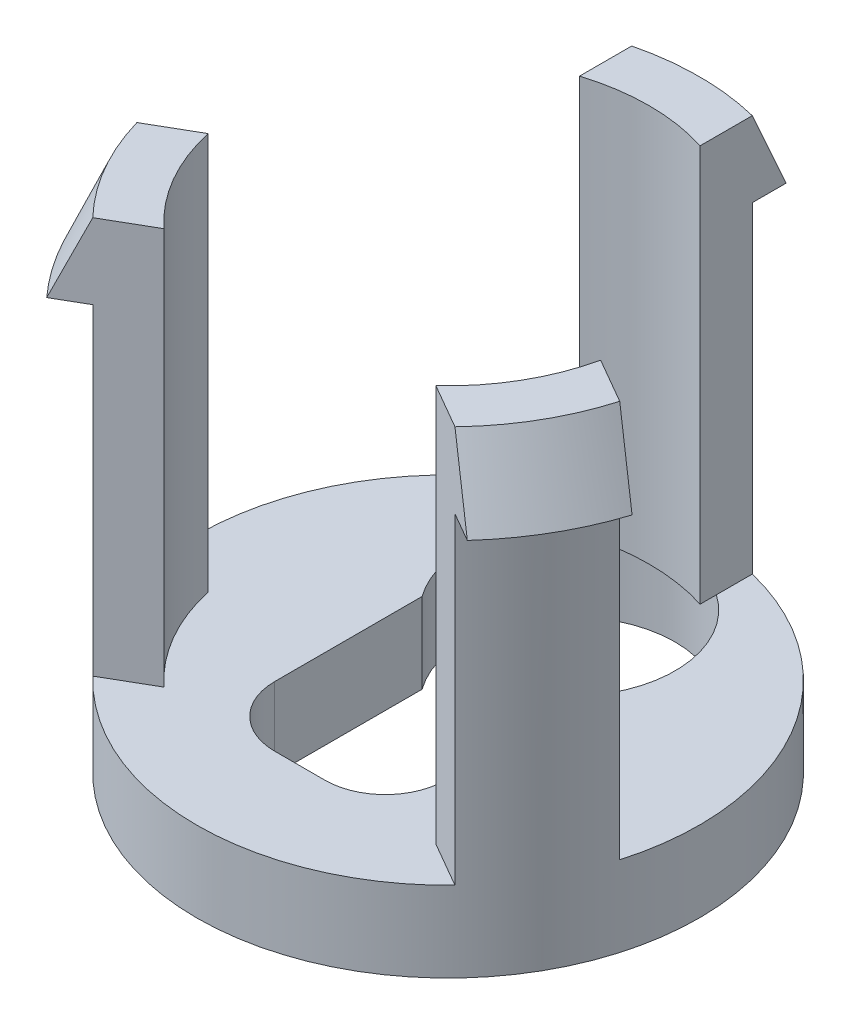
ISO-10303-21;
HEADER;
FILE_DESCRIPTION(('STEP AP214'),'2;1');
FILE_NAME('part.step','',(''),(''),'','','');
FILE_SCHEMA(('AUTOMOTIVE_DESIGN { 1 0 10303 214 1 1 1 1 }'));
ENDSEC;
DATA;
#1=APPLICATION_CONTEXT('core data for automotive mechanical design processes');
#2=APPLICATION_PROTOCOL_DEFINITION('international standard','automotive_design',2000,#1);
#3=PRODUCT_CONTEXT('',#1,'mechanical');
#4=PRODUCT('Part','Part','',(#3));
#5=PRODUCT_RELATED_PRODUCT_CATEGORY('part','',(#4));
#6=PRODUCT_DEFINITION_FORMATION('','',#4);
#7=PRODUCT_DEFINITION_CONTEXT('part definition',#1,'design');
#8=PRODUCT_DEFINITION('design','',#6,#7);
#9=PRODUCT_DEFINITION_SHAPE('','',#8);
#10=(LENGTH_UNIT() NAMED_UNIT(*) SI_UNIT(.MILLI.,.METRE.));
#11=(NAMED_UNIT(*) PLANE_ANGLE_UNIT() SI_UNIT($,.RADIAN.));
#12=(NAMED_UNIT(*) SI_UNIT($,.STERADIAN.) SOLID_ANGLE_UNIT());
#13=UNCERTAINTY_MEASURE_WITH_UNIT(LENGTH_MEASURE(1.E-05),#10,'distance_accuracy_value','');
#14=(GEOMETRIC_REPRESENTATION_CONTEXT(3) GLOBAL_UNCERTAINTY_ASSIGNED_CONTEXT((#13)) GLOBAL_UNIT_ASSIGNED_CONTEXT((#10,
#11,#12)) REPRESENTATION_CONTEXT('',''));
#15=CARTESIAN_POINT('',(0.,0.,0.));
#16=DIRECTION('',(0.,0.,1.));
#17=DIRECTION('',(1.,0.,0.));
#18=AXIS2_PLACEMENT_3D('',#15,#16,#17);
#19=CARTESIAN_POINT('',(0.,8.,-5.65386443980464));
#20=DIRECTION('',(0.,-1.,0.));
#21=DIRECTION('',(0.,0.,-1.));
#22=AXIS2_PLACEMENT_3D('',#19,#20,#21);
#23=PLANE('',#22);
#24=DIRECTION('',(0.,0.,-1.));
#25=VECTOR('',#24,1.);
#26=CARTESIAN_POINT('',(1.2,8.,-5.52505050689018));
#27=LINE('',#26,#25);
#28=CARTESIAN_POINT('',(1.2,8.,-4.85386443980464));
#29=VERTEX_POINT('',#28);
#30=CARTESIAN_POINT('',(1.2,8.,-5.52505050689018));
#31=VERTEX_POINT('',#30);
#32=EDGE_CURVE('E265',#29,#31,#27,.T.);
#33=ORIENTED_EDGE('',*,*,#32,.F.);
#34=CARTESIAN_POINT('',(0.,8.,0.));
#35=DIRECTION('',(0.,-1.,0.));
#36=DIRECTION('',(0.,0.,-1.));
#37=AXIS2_PLACEMENT_3D('',#34,#35,#36);
#38=CIRCLE('',#37,5.);
#39=CARTESIAN_POINT('',(-1.2,8.,-4.85386443980464));
#40=VERTEX_POINT('',#39);
#41=EDGE_CURVE('E365',#40,#29,#38,.T.);
#42=ORIENTED_EDGE('',*,*,#41,.F.);
#43=DIRECTION('',(0.,0.,1.));
#44=VECTOR('',#43,1.);
#45=CARTESIAN_POINT('',(-1.2,8.,-4.85386443980464));
#46=LINE('',#45,#44);
#47=CARTESIAN_POINT('',(-1.2,8.,-5.52505050689018));
#48=VERTEX_POINT('',#47);
#49=EDGE_CURVE('E496',#48,#40,#46,.T.);
#50=ORIENTED_EDGE('',*,*,#49,.F.);
#51=CARTESIAN_POINT('',(0.,8.00000000000001,0.));
#52=DIRECTION('',(0.,-1.,0.));
#53=DIRECTION('',(0.,0.,-1.));
#54=AXIS2_PLACEMENT_3D('',#51,#52,#53);
#55=CIRCLE('',#54,5.65386443980464);
#56=EDGE_CURVE('E357',#48,#31,#55,.T.);
#57=ORIENTED_EDGE('',*,*,#56,.T.);
#58=EDGE_LOOP('',(#33,#42,#50,#57));
#59=FACE_BOUND('',#58,.T.);
#60=ADVANCED_FACE('F33',(#59),#23,.T.);
#61=CARTESIAN_POINT('',(0.,8.00000000000001,0.));
#62=DIRECTION('',(0.,-1.,0.));
#63=DIRECTION('',(0.,0.,-1.));
#64=AXIS2_PLACEMENT_3D('',#61,#62,#63);
#65=CONICAL_SURFACE('',#64,5.65386443980464,0.411074791521968);
#66=CARTESIAN_POINT('',(1.2,5.21684046626345,-6.76140938545169));
#67=CARTESIAN_POINT('',(1.2,5.71747251316698,-6.53974644398967));
#68=CARTESIAN_POINT('',(1.2,6.21799738542379,-6.31784047831135));
#69=CARTESIAN_POINT('',(1.2,7.21870370792567,-5.87326281222212));
#70=CARTESIAN_POINT('',(1.2,7.7188851599612,-5.65059111584039));
#71=CARTESIAN_POINT('',(1.2,8.71878257367702,-5.20419920142983));
#72=CARTESIAN_POINT('',(1.2,9.21849853373002,-4.98047897975189));
#73=CARTESIAN_POINT('',(1.2,9.9675476490754,-4.64372744977575));
#74=CARTESIAN_POINT('',(1.2,10.2171438691791,-4.53128144443169));
#75=CARTESIAN_POINT('',(1.2,10.7161131188899,-4.30589453839525));
#76=CARTESIAN_POINT('',(1.2,10.9654861482009,-4.19295363704744));
#77=CARTESIAN_POINT('',(1.2,11.2147233456066,-4.07971309248931));
#78=B_SPLINE_CURVE_WITH_KNOTS('',3,(#66,#67,#68,#69,#70,#71,#72,#73,#74,#75,#76,#77),
.UNSPECIFIED.,.F.,.F.,(4,2,2,2,2,4),(0.,1.64252968817511,3.28505074673803,4.92757752588393,
5.74884521357266,6.57011398925771),.UNSPECIFIED.);
#79=CARTESIAN_POINT('',(1.2,9.5,-4.85386443980464));
#80=VERTEX_POINT('',#79);
#81=EDGE_CURVE('E274',#31,#80,#78,.T.);
#82=ORIENTED_EDGE('',*,*,#81,.F.);
#83=ORIENTED_EDGE('',*,*,#56,.F.);
#84=CARTESIAN_POINT('',(-1.2,11.2147233456066,-4.07971309248931));
#85=CARTESIAN_POINT('',(-1.2,10.9654861482009,-4.19295363704744));
#86=CARTESIAN_POINT('',(-1.2,10.7161131188899,-4.30589453839525));
#87=CARTESIAN_POINT('',(-1.2,10.2171438691791,-4.53128144443169));
#88=CARTESIAN_POINT('',(-1.2,9.96754764907539,-4.64372744977575));
#89=CARTESIAN_POINT('',(-1.2,9.21849853373002,-4.9804789797519));
#90=CARTESIAN_POINT('',(-1.2,8.71878257367702,-5.20419920142983));
#91=CARTESIAN_POINT('',(-1.2,7.7188851599612,-5.65059111584039));
#92=CARTESIAN_POINT('',(-1.2,7.21870370792567,-5.87326281222212));
#93=CARTESIAN_POINT('',(-1.2,6.21799738542379,-6.31784047831135));
#94=CARTESIAN_POINT('',(-1.2,5.71747251316698,-6.53974644398967));
#95=CARTESIAN_POINT('',(-1.2,5.21684046626345,-6.76140938545169));
#96=B_SPLINE_CURVE_WITH_KNOTS('',3,(#84,#85,#86,#87,#88,#89,#90,#91,#92,#93,#94,#95),
.UNSPECIFIED.,.F.,.F.,(4,2,2,2,2,4),(0.,0.82126877568505,1.64253646337379,3.28506324251968,
4.9275843010826,6.57011398925771),.UNSPECIFIED.);
#97=CARTESIAN_POINT('',(-1.2,9.5,-4.85386443980464));
#98=VERTEX_POINT('',#97);
#99=EDGE_CURVE('E358',#98,#48,#96,.T.);
#100=ORIENTED_EDGE('',*,*,#99,.F.);
#101=CARTESIAN_POINT('',(0.,9.5,0.));
#102=DIRECTION('',(0.,1.,0.));
#103=DIRECTION('',(0.,0.,1.));
#104=AXIS2_PLACEMENT_3D('',#101,#102,#103);
#105=CIRCLE('',#104,5.);
#106=EDGE_CURVE('E429',#80,#98,#105,.T.);
#107=ORIENTED_EDGE('',*,*,#106,.F.);
#108=EDGE_LOOP('',(#82,#83,#100,#107));
#109=FACE_BOUND('',#108,.T.);
#110=ADVANCED_FACE('F321',(#109),#65,.T.);
#111=DIRECTION('',(-0.866025403784437,0.,-0.500000000000002));
#112=VECTOR('',#111,1.);
#113=CARTESIAN_POINT('',(4.80356991139674,8.,1.38770173536102));
#114=LINE('',#113,#112);
#115=CARTESIAN_POINT('',(5.38483409615898,8.,1.72329476890379));
#116=VERTEX_POINT('',#115);
#117=CARTESIAN_POINT('',(4.80356991139674,8.,1.38770173536102));
#118=VERTEX_POINT('',#117);
#119=EDGE_CURVE('E263',#116,#118,#114,.T.);
#120=ORIENTED_EDGE('',*,*,#119,.F.);
#121=CARTESIAN_POINT('',(4.18483409615897,8.,3.80175573798644));
#122=VERTEX_POINT('',#121);
#123=EDGE_CURVE('E355',#116,#122,#55,.T.);
#124=ORIENTED_EDGE('',*,*,#123,.T.);
#125=DIRECTION('',(0.866025403784436,0.,0.500000000000004));
#126=VECTOR('',#125,1.);
#127=CARTESIAN_POINT('',(4.18483409615897,8.,3.80175573798644));
#128=LINE('',#127,#126);
#129=CARTESIAN_POINT('',(3.60356991139673,8.,3.46616270444366));
#130=VERTEX_POINT('',#129);
#131=EDGE_CURVE('E348',#130,#122,#128,.T.);
#132=ORIENTED_EDGE('',*,*,#131,.F.);
#133=EDGE_CURVE('E364',#118,#130,#38,.T.);
#134=ORIENTED_EDGE('',*,*,#133,.F.);
#135=EDGE_LOOP('',(#120,#124,#132,#134));
#136=FACE_BOUND('',#135,.T.);
#137=ADVANCED_FACE('F323',(#136),#23,.T.);
#138=CARTESIAN_POINT('',(4.80349213645757,9.5002,1.38765683197895));
#139=CARTESIAN_POINT('',(4.90066141870623,9.25027080369993,1.44375754324218));
#140=CARTESIAN_POINT('',(4.99769766276035,9.00027286931798,1.49978144486798));
#141=CARTESIAN_POINT('',(5.19150406998907,8.50013953597828,1.61167562625215));
#142=CARTESIAN_POINT('',(5.28827423317601,8.25000413702689,1.66754590601766));
#143=CARTESIAN_POINT('',(5.38491135818073,7.9998,1.72333937615284));
#144=B_SPLINE_CURVE_WITH_KNOTS('',3,(#138,#139,#140,#141,#142,#143),.UNSPECIFIED.,.F.,.F.,(4,2,
4),(0.,0.821877786948107,1.64375553581094),.UNSPECIFIED.);
#145=CARTESIAN_POINT('',(4.80356991139674,9.5,1.38770173536102));
#146=VERTEX_POINT('',#145);
#147=EDGE_CURVE('E267',#146,#116,#144,.T.);
#148=ORIENTED_EDGE('',*,*,#147,.F.);
#149=CARTESIAN_POINT('',(3.60356991139673,9.5,3.46616270444366));
#150=VERTEX_POINT('',#149);
#151=EDGE_CURVE('E425',#150,#146,#105,.T.);
#152=ORIENTED_EDGE('',*,*,#151,.F.);
#153=CARTESIAN_POINT('',(4.18491135818072,7.9998,3.80180034523549));
#154=CARTESIAN_POINT('',(4.088274233176,8.25000413702689,3.7460068751003));
#155=CARTESIAN_POINT('',(3.99150406998906,8.50013953597828,3.6901365953348));
#156=CARTESIAN_POINT('',(3.79769766276034,9.00027286931798,3.57824241395062));
#157=CARTESIAN_POINT('',(3.70066141870622,9.25027080369992,3.52221851232483));
#158=CARTESIAN_POINT('',(3.60349213645756,9.5002,3.4661178010616));
#159=B_SPLINE_CURVE_WITH_KNOTS('',3,(#153,#154,#155,#156,#157,#158),.UNSPECIFIED.,.F.,.F.,(4,2,
4),(0.,0.821877748862831,1.64375553581094),.UNSPECIFIED.);
#160=EDGE_CURVE('E497',#122,#150,#159,.T.);
#161=ORIENTED_EDGE('',*,*,#160,.F.);
#162=ORIENTED_EDGE('',*,*,#123,.F.);
#163=EDGE_LOOP('',(#148,#152,#161,#162));
#164=FACE_BOUND('',#163,.T.);
#165=ADVANCED_FACE('F297',(#164),#65,.T.);
#166=CARTESIAN_POINT('',(0.,9.5,0.));
#167=DIRECTION('',(0.,1.,0.));
#168=DIRECTION('',(0.,0.,1.));
#169=AXIS2_PLACEMENT_3D('',#166,#167,#168);
#170=PLANE('',#169);
#171=CARTESIAN_POINT('',(-4.80356991139675,9.5,1.38770173536095));
#172=VERTEX_POINT('',#171);
#173=CARTESIAN_POINT('',(-3.60356991139677,9.5,3.46616270444361));
#174=VERTEX_POINT('',#173);
#175=EDGE_CURVE('E430',#172,#174,#105,.T.);
#176=ORIENTED_EDGE('',*,*,#175,.T.);
#177=DIRECTION('',(0.866025403784443,0.,-0.499999999999992));
#178=VECTOR('',#177,1.);
#179=CARTESIAN_POINT('',(-3.60356991139677,9.5,3.46616270444361));
#180=LINE('',#179,#178);
#181=CARTESIAN_POINT('',(-2.70454232837169,9.5,2.94710888737519));
#182=VERTEX_POINT('',#181);
#183=EDGE_CURVE('E390',#174,#182,#180,.T.);
#184=ORIENTED_EDGE('',*,*,#183,.T.);
#185=CARTESIAN_POINT('',(0.,9.5,0.));
#186=DIRECTION('',(0.,-1.,0.));
#187=DIRECTION('',(0.866025403784443,0.,-0.499999999999992));
#188=AXIS2_PLACEMENT_3D('',#185,#186,#187);
#189=CIRCLE('',#188,4.);
#190=CARTESIAN_POINT('',(-3.90454232837167,9.5,0.868647918292529));
#191=VERTEX_POINT('',#190);
#192=EDGE_CURVE('E486',#182,#191,#189,.T.);
#193=ORIENTED_EDGE('',*,*,#192,.T.);
#194=DIRECTION('',(-0.866025403784443,0.,0.499999999999992));
#195=VECTOR('',#194,1.);
#196=CARTESIAN_POINT('',(-4.80356991139675,9.5,1.38770173536095));
#197=LINE('',#196,#195);
#198=EDGE_CURVE('E385',#191,#172,#197,.T.);
#199=ORIENTED_EDGE('',*,*,#198,.T.);
#200=EDGE_LOOP('',(#176,#184,#193,#199));
#201=FACE_BOUND('',#200,.T.);
#202=ADVANCED_FACE('F293',(#201),#170,.T.);
#203=DIRECTION('',(0.866025403784437,0.,0.500000000000004));
#204=VECTOR('',#203,1.);
#205=CARTESIAN_POINT('',(3.60356991139673,9.5,3.46616270444366));
#206=LINE('',#205,#204);
#207=CARTESIAN_POINT('',(2.70454232837165,9.5,2.94710888737523));
#208=VERTEX_POINT('',#207);
#209=EDGE_CURVE('E406',#208,#150,#206,.T.);
#210=ORIENTED_EDGE('',*,*,#209,.T.);
#211=ORIENTED_EDGE('',*,*,#151,.T.);
#212=DIRECTION('',(-0.866025403784437,0.,-0.500000000000004));
#213=VECTOR('',#212,1.);
#214=CARTESIAN_POINT('',(4.80356991139674,9.5,1.38770173536102));
#215=LINE('',#214,#213);
#216=CARTESIAN_POINT('',(3.90454232837166,9.5,0.868647918292585));
#217=VERTEX_POINT('',#216);
#218=EDGE_CURVE('E401',#146,#217,#215,.T.);
#219=ORIENTED_EDGE('',*,*,#218,.T.);
#220=CARTESIAN_POINT('',(0.,9.5,0.));
#221=DIRECTION('',(0.,-1.,0.));
#222=DIRECTION('',(-0.866025403784436,0.,-0.500000000000004));
#223=AXIS2_PLACEMENT_3D('',#220,#221,#222);
#224=CIRCLE('',#223,4.);
#225=EDGE_CURVE('E403',#217,#208,#224,.T.);
#226=ORIENTED_EDGE('',*,*,#225,.T.);
#227=EDGE_LOOP('',(#210,#211,#219,#226));
#228=FACE_BOUND('',#227,.T.);
#229=ADVANCED_FACE('F296',(#228),#170,.T.);
#230=DIRECTION('',(0.,0.,-1.));
#231=VECTOR('',#230,1.);
#232=CARTESIAN_POINT('',(1.2,9.5,-4.85386443980464));
#233=LINE('',#232,#231);
#234=CARTESIAN_POINT('',(1.2,9.5,-3.81575680566778));
#235=VERTEX_POINT('',#234);
#236=EDGE_CURVE('E434',#235,#80,#233,.T.);
#237=ORIENTED_EDGE('',*,*,#236,.T.);
#238=ORIENTED_EDGE('',*,*,#106,.T.);
#239=DIRECTION('',(0.,0.,1.));
#240=VECTOR('',#239,1.);
#241=CARTESIAN_POINT('',(-1.2,9.5,-4.85386443980464));
#242=LINE('',#241,#240);
#243=CARTESIAN_POINT('',(-1.2,9.5,-3.81575680566778));
#244=VERTEX_POINT('',#243);
#245=EDGE_CURVE('E428',#98,#244,#242,.T.);
#246=ORIENTED_EDGE('',*,*,#245,.T.);
#247=CARTESIAN_POINT('',(0.,9.5,0.));
#248=DIRECTION('',(0.,-1.,0.));
#249=DIRECTION('',(0.,0.,1.));
#250=AXIS2_PLACEMENT_3D('',#247,#248,#249);
#251=CIRCLE('',#250,4.);
#252=EDGE_CURVE('E432',#244,#235,#251,.T.);
#253=ORIENTED_EDGE('',*,*,#252,.T.);
#254=EDGE_LOOP('',(#237,#238,#246,#253));
#255=FACE_BOUND('',#254,.T.);
#256=ADVANCED_FACE('F299',(#255),#170,.T.);
#257=DIRECTION('',(0.866025403784444,0.,-0.499999999999992));
#258=VECTOR('',#257,1.);
#259=CARTESIAN_POINT('',(-3.60356991139677,8.,3.46616270444361));
#260=LINE('',#259,#258);
#261=CARTESIAN_POINT('',(-4.18483409615902,8.,3.80175573798638));
#262=VERTEX_POINT('',#261);
#263=CARTESIAN_POINT('',(-3.60356991139677,8.,3.46616270444361));
#264=VERTEX_POINT('',#263);
#265=EDGE_CURVE('E340',#262,#264,#260,.T.);
#266=ORIENTED_EDGE('',*,*,#265,.F.);
#267=CARTESIAN_POINT('',(-5.384834096159,8.,1.72329476890371));
#268=VERTEX_POINT('',#267);
#269=EDGE_CURVE('E342',#262,#268,#55,.T.);
#270=ORIENTED_EDGE('',*,*,#269,.T.);
#271=DIRECTION('',(-0.866025403784443,0.,0.499999999999992));
#272=VECTOR('',#271,1.);
#273=CARTESIAN_POINT('',(-5.384834096159,8.,1.72329476890371));
#274=LINE('',#273,#272);
#275=CARTESIAN_POINT('',(-4.80356991139675,8.,1.38770173536095));
#276=VERTEX_POINT('',#275);
#277=EDGE_CURVE('E480',#276,#268,#274,.T.);
#278=ORIENTED_EDGE('',*,*,#277,.F.);
#279=EDGE_CURVE('E345',#264,#276,#38,.T.);
#280=ORIENTED_EDGE('',*,*,#279,.F.);
#281=EDGE_LOOP('',(#266,#270,#278,#280));
#282=FACE_BOUND('',#281,.T.);
#283=ADVANCED_FACE('F313',(#282),#23,.T.);
#284=CARTESIAN_POINT('',(0.,1.6,0.));
#285=DIRECTION('',(0.,1.,0.));
#286=DIRECTION('',(0.,0.,1.));
#287=AXIS2_PLACEMENT_3D('',#284,#285,#286);
#288=PLANE('',#287);
#289=CARTESIAN_POINT('',(0.,1.6,-2.41619037896907));
#290=DIRECTION('',(0.,1.,0.));
#291=DIRECTION('',(0.,0.,1.));
#292=AXIS2_PLACEMENT_3D('',#289,#290,#291);
#293=CIRCLE('',#292,2.1);
#294=CARTESIAN_POINT('',(1.70000000000001,1.6,-1.18330757837528));
#295=VERTEX_POINT('',#294);
#296=CARTESIAN_POINT('',(1.2,1.6,-4.13955917293049));
#297=VERTEX_POINT('',#296);
#298=EDGE_CURVE('E59',#295,#297,#293,.T.);
#299=ORIENTED_EDGE('',*,*,#298,.F.);
#300=DIRECTION('',(0.,0.,-1.));
#301=VECTOR('',#300,1.);
#302=CARTESIAN_POINT('',(1.70000000000001,1.6,1.74999999999999));
#303=LINE('',#302,#301);
#304=CARTESIAN_POINT('',(1.70000000000001,1.6,1.74999999999999));
#305=VERTEX_POINT('',#304);
#306=EDGE_CURVE('E226',#305,#295,#303,.T.);
#307=ORIENTED_EDGE('',*,*,#306,.F.);
#308=CARTESIAN_POINT('',(0.500000000000014,1.6,1.74999999999999));
#309=DIRECTION('',(0.,1.,0.));
#310=DIRECTION('',(0.,0.,1.));
#311=AXIS2_PLACEMENT_3D('',#308,#309,#310);
#312=CIRCLE('',#311,1.2);
#313=CARTESIAN_POINT('',(0.500000000000014,1.6,2.94999999999999));
#314=VERTEX_POINT('',#313);
#315=EDGE_CURVE('E229',#314,#305,#312,.T.);
#316=ORIENTED_EDGE('',*,*,#315,.F.);
#317=DIRECTION('',(1.,0.,0.));
#318=VECTOR('',#317,1.);
#319=CARTESIAN_POINT('',(-0.499999999999986,1.6,2.94999999999999));
#320=LINE('',#319,#318);
#321=CARTESIAN_POINT('',(-0.499999999999986,1.6,2.94999999999999));
#322=VERTEX_POINT('',#321);
#323=EDGE_CURVE('E246',#322,#314,#320,.T.);
#324=ORIENTED_EDGE('',*,*,#323,.F.);
#325=CARTESIAN_POINT('',(-0.499999999999986,1.6,1.74999999999999));
#326=DIRECTION('',(0.,1.,0.));
#327=DIRECTION('',(0.,0.,1.));
#328=AXIS2_PLACEMENT_3D('',#325,#326,#327);
#329=CIRCLE('',#328,1.2);
#330=CARTESIAN_POINT('',(-1.69999999999999,1.6,1.74999999999999));
#331=VERTEX_POINT('',#330);
#332=EDGE_CURVE('E243',#331,#322,#329,.T.);
#333=ORIENTED_EDGE('',*,*,#332,.F.);
#334=DIRECTION('',(0.,0.,1.));
#335=VECTOR('',#334,1.);
#336=CARTESIAN_POINT('',(-1.69999999999999,1.6,-1.18330757837528));
#337=LINE('',#336,#335);
#338=CARTESIAN_POINT('',(-1.69999999999999,1.6,-1.18330757837528));
#339=VERTEX_POINT('',#338);
#340=EDGE_CURVE('E240',#339,#331,#337,.T.);
#341=ORIENTED_EDGE('',*,*,#340,.F.);
#342=CARTESIAN_POINT('',(-1.2,1.6,-4.13955917293047));
#343=VERTEX_POINT('',#342);
#344=EDGE_CURVE('E210',#343,#339,#293,.T.);
#345=ORIENTED_EDGE('',*,*,#344,.F.);
#346=DIRECTION('',(0.,0.,1.));
#347=VECTOR('',#346,1.);
#348=CARTESIAN_POINT('',(-1.2,1.6,-4.85386443980464));
#349=LINE('',#348,#347);
#350=CARTESIAN_POINT('',(-1.2,1.6,-4.85386443980464));
#351=VERTEX_POINT('',#350);
#352=EDGE_CURVE('E424',#351,#343,#349,.T.);
#353=ORIENTED_EDGE('',*,*,#352,.F.);
#354=CARTESIAN_POINT('',(0.,1.6,0.));
#355=DIRECTION('',(0.,1.,0.));
#356=DIRECTION('',(0.,0.,1.));
#357=AXIS2_PLACEMENT_3D('',#354,#355,#356);
#358=CIRCLE('',#357,5.);
#359=CARTESIAN_POINT('',(-4.80356991139675,1.6,1.38770173536095));
#360=VERTEX_POINT('',#359);
#361=EDGE_CURVE('E11',#351,#360,#358,.T.);
#362=ORIENTED_EDGE('',*,*,#361,.T.);
#363=DIRECTION('',(-0.866025403784443,0.,0.499999999999992));
#364=VECTOR('',#363,1.);
#365=CARTESIAN_POINT('',(-4.80356991139675,1.6,1.38770173536095));
#366=LINE('',#365,#364);
#367=CARTESIAN_POINT('',(-3.90454232837167,1.6,0.868647918292529));
#368=VERTEX_POINT('',#367);
#369=EDGE_CURVE('E382',#368,#360,#366,.T.);
#370=ORIENTED_EDGE('',*,*,#369,.F.);
#371=CARTESIAN_POINT('',(0.,1.6,0.));
#372=DIRECTION('',(0.,-1.,0.));
#373=DIRECTION('',(0.866025403784443,0.,-0.499999999999992));
#374=AXIS2_PLACEMENT_3D('',#371,#372,#373);
#375=CIRCLE('',#374,4.);
#376=CARTESIAN_POINT('',(-2.70454232837169,1.6,2.94710888737519));
#377=VERTEX_POINT('',#376);
#378=EDGE_CURVE('E376',#377,#368,#375,.T.);
#379=ORIENTED_EDGE('',*,*,#378,.F.);
#380=DIRECTION('',(0.866025403784443,0.,-0.499999999999992));
#381=VECTOR('',#380,1.);
#382=CARTESIAN_POINT('',(-3.60356991139677,1.6,3.46616270444361));
#383=LINE('',#382,#381);
#384=CARTESIAN_POINT('',(-3.60356991139677,1.6,3.46616270444361));
#385=VERTEX_POINT('',#384);
#386=EDGE_CURVE('E370',#385,#377,#383,.T.);
#387=ORIENTED_EDGE('',*,*,#386,.F.);
#388=CARTESIAN_POINT('',(3.60356991139673,1.6,3.46616270444366));
#389=VERTEX_POINT('',#388);
#390=EDGE_CURVE('E43',#385,#389,#358,.T.);
#391=ORIENTED_EDGE('',*,*,#390,.T.);
#392=DIRECTION('',(0.866025403784437,0.,0.500000000000004));
#393=VECTOR('',#392,1.);
#394=CARTESIAN_POINT('',(3.60356991139673,1.6,3.46616270444366));
#395=LINE('',#394,#393);
#396=CARTESIAN_POINT('',(2.70454232837165,1.6,2.94710888737523));
#397=VERTEX_POINT('',#396);
#398=EDGE_CURVE('E404',#397,#389,#395,.T.);
#399=ORIENTED_EDGE('',*,*,#398,.F.);
#400=CARTESIAN_POINT('',(0.,1.6,0.));
#401=DIRECTION('',(0.,-1.,0.));
#402=DIRECTION('',(-0.866025403784436,0.,-0.500000000000004));
#403=AXIS2_PLACEMENT_3D('',#400,#401,#402);
#404=CIRCLE('',#403,4.);
#405=CARTESIAN_POINT('',(3.90454232837166,1.6,0.868647918292585));
#406=VERTEX_POINT('',#405);
#407=EDGE_CURVE('E411',#406,#397,#404,.T.);
#408=ORIENTED_EDGE('',*,*,#407,.F.);
#409=DIRECTION('',(-0.866025403784437,0.,-0.500000000000004));
#410=VECTOR('',#409,1.);
#411=CARTESIAN_POINT('',(4.80356991139674,1.6,1.38770173536102));
#412=LINE('',#411,#410);
#413=CARTESIAN_POINT('',(4.80356991139674,1.6,1.38770173536102));
#414=VERTEX_POINT('',#413);
#415=EDGE_CURVE('E400',#414,#406,#412,.T.);
#416=ORIENTED_EDGE('',*,*,#415,.F.);
#417=CARTESIAN_POINT('',(1.2,1.6,-4.85386443980464));
#418=VERTEX_POINT('',#417);
#419=EDGE_CURVE('E454',#414,#418,#358,.T.);
#420=ORIENTED_EDGE('',*,*,#419,.T.);
#421=DIRECTION('',(0.,0.,-1.));
#422=VECTOR('',#421,1.);
#423=CARTESIAN_POINT('',(1.2,1.6,-4.85386443980464));
#424=LINE('',#423,#422);
#425=EDGE_CURVE('E37',#297,#418,#424,.T.);
#426=ORIENTED_EDGE('',*,*,#425,.F.);
#427=EDGE_LOOP('',(#299,#307,#316,#324,#333,#341,#345,#353,#362,#370,#379,#387,#391,#399,#408,
#416,#420,#426));
#428=FACE_BOUND('',#427,.T.);
#429=ADVANCED_FACE('F311',(#428),#288,.T.);
#430=CARTESIAN_POINT('',(0.,1.6,0.));
#431=DIRECTION('',(0.,-1.,0.));
#432=DIRECTION('',(0.,0.,-1.));
#433=AXIS2_PLACEMENT_3D('',#430,#431,#432);
#434=CYLINDRICAL_SURFACE('',#433,5.);
#435=DIRECTION('',(0.,-1.,0.));
#436=VECTOR('',#435,1.);
#437=CARTESIAN_POINT('',(4.80356991139674,9.5,1.38770173536102));
#438=LINE('',#437,#436);
#439=EDGE_CURVE('E422',#118,#414,#438,.T.);
#440=ORIENTED_EDGE('',*,*,#439,.F.);
#441=ORIENTED_EDGE('',*,*,#133,.T.);
#442=DIRECTION('',(0.,-1.,0.));
#443=VECTOR('',#442,1.);
#444=CARTESIAN_POINT('',(3.60356991139673,9.5,3.46616270444366));
#445=LINE('',#444,#443);
#446=EDGE_CURVE('E409',#130,#389,#445,.T.);
#447=ORIENTED_EDGE('',*,*,#446,.T.);
#448=ORIENTED_EDGE('',*,*,#390,.F.);
#449=DIRECTION('',(0.,-1.,0.));
#450=VECTOR('',#449,1.);
#451=CARTESIAN_POINT('',(-3.60356991139677,9.5,3.46616270444361));
#452=LINE('',#451,#450);
#453=EDGE_CURVE('E398',#264,#385,#452,.T.);
#454=ORIENTED_EDGE('',*,*,#453,.F.);
#455=ORIENTED_EDGE('',*,*,#279,.T.);
#456=DIRECTION('',(0.,-1.,0.));
#457=VECTOR('',#456,1.);
#458=CARTESIAN_POINT('',(-4.80356991139675,9.5,1.38770173536095));
#459=LINE('',#458,#457);
#460=EDGE_CURVE('E391',#276,#360,#459,.T.);
#461=ORIENTED_EDGE('',*,*,#460,.T.);
#462=ORIENTED_EDGE('',*,*,#361,.F.);
#463=DIRECTION('',(0.,-1.,0.));
#464=VECTOR('',#463,1.);
#465=CARTESIAN_POINT('',(-1.2,9.5,-4.85386443980464));
#466=LINE('',#465,#464);
#467=EDGE_CURVE('E458',#40,#351,#466,.T.);
#468=ORIENTED_EDGE('',*,*,#467,.F.);
#469=ORIENTED_EDGE('',*,*,#41,.T.);
#470=DIRECTION('',(0.,-1.,0.));
#471=VECTOR('',#470,1.);
#472=CARTESIAN_POINT('',(1.2,9.5,-4.85386443980464));
#473=LINE('',#472,#471);
#474=EDGE_CURVE('E437',#29,#418,#473,.T.);
#475=ORIENTED_EDGE('',*,*,#474,.T.);
#476=ORIENTED_EDGE('',*,*,#419,.F.);
#477=EDGE_LOOP('',(#440,#441,#447,#448,#454,#455,#461,#462,#468,#469,#475,#476));
#478=FACE_BOUND('',#477,.T.);
#479=CARTESIAN_POINT('',(0.,0.,0.));
#480=DIRECTION('',(0.,1.,0.));
#481=DIRECTION('',(0.,0.,1.));
#482=AXIS2_PLACEMENT_3D('',#479,#480,#481);
#483=CIRCLE('',#482,5.);
#484=CARTESIAN_POINT('',(0.,0.,5.));
#485=VERTEX_POINT('',#484);
#486=EDGE_CURVE('E459',#485,#485,#483,.T.);
#487=ORIENTED_EDGE('',*,*,#486,.T.);
#488=EDGE_LOOP('',(#487));
#489=FACE_BOUND('',#488,.T.);
#490=ADVANCED_FACE('F35',(#478,#489),#434,.T.);
#491=CARTESIAN_POINT('',(0.,0.,0.));
#492=DIRECTION('',(0.,1.,0.));
#493=DIRECTION('',(0.,0.,1.));
#494=AXIS2_PLACEMENT_3D('',#491,#492,#493);
#495=PLANE('',#494);
#496=DIRECTION('',(0.,0.,-1.));
#497=VECTOR('',#496,1.);
#498=CARTESIAN_POINT('',(1.70000000000001,0.,1.74999999999999));
#499=LINE('',#498,#497);
#500=CARTESIAN_POINT('',(1.70000000000001,0.,1.74999999999999));
#501=VERTEX_POINT('',#500);
#502=CARTESIAN_POINT('',(1.70000000000001,0.,-1.18330757837528));
#503=VERTEX_POINT('',#502);
#504=EDGE_CURVE('E215',#501,#503,#499,.T.);
#505=ORIENTED_EDGE('',*,*,#504,.T.);
#506=CARTESIAN_POINT('',(0.,0.,-2.41619037896907));
#507=DIRECTION('',(0.,1.,0.));
#508=DIRECTION('',(0.,0.,1.));
#509=AXIS2_PLACEMENT_3D('',#506,#507,#508);
#510=CIRCLE('',#509,2.1);
#511=CARTESIAN_POINT('',(-1.69999999999999,0.,-1.18330757837528));
#512=VERTEX_POINT('',#511);
#513=EDGE_CURVE('E207',#503,#512,#510,.T.);
#514=ORIENTED_EDGE('',*,*,#513,.T.);
#515=DIRECTION('',(0.,0.,1.));
#516=VECTOR('',#515,1.);
#517=CARTESIAN_POINT('',(-1.69999999999999,0.,-1.18330757837528));
#518=LINE('',#517,#516);
#519=CARTESIAN_POINT('',(-1.69999999999999,0.,1.74999999999999));
#520=VERTEX_POINT('',#519);
#521=EDGE_CURVE('E218',#512,#520,#518,.T.);
#522=ORIENTED_EDGE('',*,*,#521,.T.);
#523=CARTESIAN_POINT('',(-0.499999999999986,0.,1.74999999999999));
#524=DIRECTION('',(0.,1.,0.));
#525=DIRECTION('',(0.,0.,1.));
#526=AXIS2_PLACEMENT_3D('',#523,#524,#525);
#527=CIRCLE('',#526,1.2);
#528=CARTESIAN_POINT('',(-0.499999999999986,0.,2.94999999999999));
#529=VERTEX_POINT('',#528);
#530=EDGE_CURVE('E51',#520,#529,#527,.T.);
#531=ORIENTED_EDGE('',*,*,#530,.T.);
#532=DIRECTION('',(1.,0.,0.));
#533=VECTOR('',#532,1.);
#534=CARTESIAN_POINT('',(-0.499999999999986,0.,2.94999999999999));
#535=LINE('',#534,#533);
#536=CARTESIAN_POINT('',(0.500000000000014,0.,2.94999999999999));
#537=VERTEX_POINT('',#536);
#538=EDGE_CURVE('E233',#529,#537,#535,.T.);
#539=ORIENTED_EDGE('',*,*,#538,.T.);
#540=CARTESIAN_POINT('',(0.500000000000014,0.,1.74999999999999));
#541=DIRECTION('',(0.,1.,0.));
#542=DIRECTION('',(0.,0.,1.));
#543=AXIS2_PLACEMENT_3D('',#540,#541,#542);
#544=CIRCLE('',#543,1.2);
#545=EDGE_CURVE('E236',#537,#501,#544,.T.);
#546=ORIENTED_EDGE('',*,*,#545,.T.);
#547=EDGE_LOOP('',(#505,#514,#522,#531,#539,#546));
#548=FACE_BOUND('',#547,.T.);
#549=ORIENTED_EDGE('',*,*,#486,.F.);
#550=EDGE_LOOP('',(#549));
#551=FACE_BOUND('',#550,.T.);
#552=ADVANCED_FACE('F222',(#548,#551),#495,.F.);
#553=CARTESIAN_POINT('',(-1.2,9.5,-4.85386443980464));
#554=DIRECTION('',(1.,0.,0.));
#555=DIRECTION('',(0.,0.,-1.));
#556=AXIS2_PLACEMENT_3D('',#553,#554,#555);
#557=PLANE('',#556);
#558=ORIENTED_EDGE('',*,*,#245,.F.);
#559=ORIENTED_EDGE('',*,*,#99,.T.);
#560=ORIENTED_EDGE('',*,*,#49,.T.);
#561=ORIENTED_EDGE('',*,*,#467,.T.);
#562=ORIENTED_EDGE('',*,*,#352,.T.);
#563=DIRECTION('',(0.,0.,1.));
#564=VECTOR('',#563,1.);
#565=CARTESIAN_POINT('',(-1.2,1.6,-4.85386443980464));
#566=LINE('',#565,#564);
#567=CARTESIAN_POINT('',(-1.2,1.6,-3.81575680566778));
#568=VERTEX_POINT('',#567);
#569=EDGE_CURVE('E253',#343,#568,#566,.T.);
#570=ORIENTED_EDGE('',*,*,#569,.T.);
#571=DIRECTION('',(0.,-1.,0.));
#572=VECTOR('',#571,1.);
#573=CARTESIAN_POINT('',(-1.2,9.5,-3.81575680566778));
#574=LINE('',#573,#572);
#575=EDGE_CURVE('E460',#244,#568,#574,.T.);
#576=ORIENTED_EDGE('',*,*,#575,.F.);
#577=EDGE_LOOP('',(#558,#559,#560,#561,#562,#570,#576));
#578=FACE_BOUND('',#577,.T.);
#579=ADVANCED_FACE('F306',(#578),#557,.F.);
#580=CARTESIAN_POINT('',(0.,9.5,0.));
#581=DIRECTION('',(0.,-1.,0.));
#582=DIRECTION('',(0.,0.,-1.));
#583=AXIS2_PLACEMENT_3D('',#580,#581,#582);
#584=CYLINDRICAL_SURFACE('',#583,4.);
#585=CARTESIAN_POINT('',(0.,1.6,0.));
#586=DIRECTION('',(0.,-1.,0.));
#587=DIRECTION('',(0.,0.,1.));
#588=AXIS2_PLACEMENT_3D('',#585,#586,#587);
#589=CIRCLE('',#588,4.);
#590=CARTESIAN_POINT('',(1.2,1.6,-3.81575680566778));
#591=VERTEX_POINT('',#590);
#592=EDGE_CURVE('E438',#568,#591,#589,.T.);
#593=ORIENTED_EDGE('',*,*,#592,.T.);
#594=DIRECTION('',(0.,-1.,0.));
#595=VECTOR('',#594,1.);
#596=CARTESIAN_POINT('',(1.2,9.5,-3.81575680566778));
#597=LINE('',#596,#595);
#598=EDGE_CURVE('E442',#235,#591,#597,.T.);
#599=ORIENTED_EDGE('',*,*,#598,.F.);
#600=ORIENTED_EDGE('',*,*,#252,.F.);
#601=ORIENTED_EDGE('',*,*,#575,.T.);
#602=EDGE_LOOP('',(#593,#599,#600,#601));
#603=FACE_BOUND('',#602,.T.);
#604=ADVANCED_FACE('F302',(#603),#584,.F.);
#605=CARTESIAN_POINT('',(1.2,9.5,-4.85386443980464));
#606=DIRECTION('',(-1.,0.,0.));
#607=DIRECTION('',(0.,0.,1.));
#608=AXIS2_PLACEMENT_3D('',#605,#606,#607);
#609=PLANE('',#608);
#610=ORIENTED_EDGE('',*,*,#474,.F.);
#611=ORIENTED_EDGE('',*,*,#32,.T.);
#612=ORIENTED_EDGE('',*,*,#81,.T.);
#613=ORIENTED_EDGE('',*,*,#236,.F.);
#614=ORIENTED_EDGE('',*,*,#598,.T.);
#615=EDGE_CURVE('E446',#591,#297,#424,.T.);
#616=ORIENTED_EDGE('',*,*,#615,.T.);
#617=ORIENTED_EDGE('',*,*,#425,.T.);
#618=EDGE_LOOP('',(#610,#611,#612,#613,#614,#616,#617));
#619=FACE_BOUND('',#618,.T.);
#620=ADVANCED_FACE('F290',(#619),#609,.F.);
#621=CARTESIAN_POINT('',(4.80356991139674,9.5,1.38770173536102));
#622=DIRECTION('',(-0.500000000000004,0.,0.866025403784437));
#623=DIRECTION('',(0.866025403784436,0.,0.500000000000004));
#624=AXIS2_PLACEMENT_3D('',#621,#622,#623);
#625=PLANE('',#624);
#626=ORIENTED_EDGE('',*,*,#218,.F.);
#627=ORIENTED_EDGE('',*,*,#147,.T.);
#628=ORIENTED_EDGE('',*,*,#119,.T.);
#629=ORIENTED_EDGE('',*,*,#439,.T.);
#630=ORIENTED_EDGE('',*,*,#415,.T.);
#631=DIRECTION('',(0.,-1.,0.));
#632=VECTOR('',#631,1.);
#633=CARTESIAN_POINT('',(3.90454232837166,9.5,0.868647918292585));
#634=LINE('',#633,#632);
#635=EDGE_CURVE('E419',#217,#406,#634,.T.);
#636=ORIENTED_EDGE('',*,*,#635,.F.);
#637=EDGE_LOOP('',(#626,#627,#628,#629,#630,#636));
#638=FACE_BOUND('',#637,.T.);
#639=ADVANCED_FACE('F284',(#638),#625,.F.);
#640=CARTESIAN_POINT('',(0.,9.5,0.));
#641=DIRECTION('',(0.,-1.,0.));
#642=DIRECTION('',(0.,0.,-1.));
#643=AXIS2_PLACEMENT_3D('',#640,#641,#642);
#644=CYLINDRICAL_SURFACE('',#643,4.);
#645=ORIENTED_EDGE('',*,*,#407,.T.);
#646=DIRECTION('',(0.,-1.,0.));
#647=VECTOR('',#646,1.);
#648=CARTESIAN_POINT('',(2.70454232837165,9.5,2.94710888737523));
#649=LINE('',#648,#647);
#650=EDGE_CURVE('E417',#208,#397,#649,.T.);
#651=ORIENTED_EDGE('',*,*,#650,.F.);
#652=ORIENTED_EDGE('',*,*,#225,.F.);
#653=ORIENTED_EDGE('',*,*,#635,.T.);
#654=EDGE_LOOP('',(#645,#651,#652,#653));
#655=FACE_BOUND('',#654,.T.);
#656=ADVANCED_FACE('F289',(#655),#644,.F.);
#657=CARTESIAN_POINT('',(3.60356991139673,9.5,3.46616270444366));
#658=DIRECTION('',(0.500000000000004,0.,-0.866025403784437));
#659=DIRECTION('',(-0.866025403784436,0.,-0.500000000000004));
#660=AXIS2_PLACEMENT_3D('',#657,#658,#659);
#661=PLANE('',#660);
#662=ORIENTED_EDGE('',*,*,#446,.F.);
#663=ORIENTED_EDGE('',*,*,#131,.T.);
#664=ORIENTED_EDGE('',*,*,#160,.T.);
#665=ORIENTED_EDGE('',*,*,#209,.F.);
#666=ORIENTED_EDGE('',*,*,#650,.T.);
#667=ORIENTED_EDGE('',*,*,#398,.T.);
#668=EDGE_LOOP('',(#662,#663,#664,#665,#666,#667));
#669=FACE_BOUND('',#668,.T.);
#670=ADVANCED_FACE('F554',(#669),#661,.F.);
#671=CARTESIAN_POINT('',(-3.60356991139677,9.5,3.46616270444361));
#672=DIRECTION('',(-0.499999999999992,0.,-0.866025403784443));
#673=DIRECTION('',(-0.866025403784443,0.,0.499999999999992));
#674=AXIS2_PLACEMENT_3D('',#671,#672,#673);
#675=PLANE('',#674);
#676=ORIENTED_EDGE('',*,*,#183,.F.);
#677=CARTESIAN_POINT('',(-3.60349213645761,9.5002,3.46611780106155));
#678=CARTESIAN_POINT('',(-3.70066141870627,9.25027080369992,3.52221851232478));
#679=CARTESIAN_POINT('',(-3.79769766276039,9.00027286931798,3.57824241395057));
#680=CARTESIAN_POINT('',(-3.99150406998911,8.50013953597828,3.69013659533475));
#681=CARTESIAN_POINT('',(-4.08827423317605,8.25000413702689,3.74600687510025));
#682=CARTESIAN_POINT('',(-4.18491135818077,7.99980000000001,3.80180034523543));
#683=B_SPLINE_CURVE_WITH_KNOTS('',3,(#677,#678,#679,#680,#681,#682),.UNSPECIFIED.,.F.,.F.,(4,2,
4),(0.,0.821877786948109,1.64375553581094),.UNSPECIFIED.);
#684=EDGE_CURVE('E352',#174,#262,#683,.T.);
#685=ORIENTED_EDGE('',*,*,#684,.T.);
#686=ORIENTED_EDGE('',*,*,#265,.T.);
#687=ORIENTED_EDGE('',*,*,#453,.T.);
#688=ORIENTED_EDGE('',*,*,#386,.T.);
#689=DIRECTION('',(0.,-1.,0.));
#690=VECTOR('',#689,1.);
#691=CARTESIAN_POINT('',(-2.70454232837169,9.5,2.94710888737519));
#692=LINE('',#691,#690);
#693=EDGE_CURVE('E396',#182,#377,#692,.T.);
#694=ORIENTED_EDGE('',*,*,#693,.F.);
#695=EDGE_LOOP('',(#676,#685,#686,#687,#688,#694));
#696=FACE_BOUND('',#695,.T.);
#697=ADVANCED_FACE('F487',(#696),#675,.F.);
#698=CARTESIAN_POINT('',(0.,9.5,0.));
#699=DIRECTION('',(0.,-1.,0.));
#700=DIRECTION('',(0.,0.,-1.));
#701=AXIS2_PLACEMENT_3D('',#698,#699,#700);
#702=CYLINDRICAL_SURFACE('',#701,4.);
#703=ORIENTED_EDGE('',*,*,#378,.T.);
#704=DIRECTION('',(0.,-1.,0.));
#705=VECTOR('',#704,1.);
#706=CARTESIAN_POINT('',(-3.90454232837167,9.5,0.868647918292529));
#707=LINE('',#706,#705);
#708=EDGE_CURVE('E393',#191,#368,#707,.T.);
#709=ORIENTED_EDGE('',*,*,#708,.F.);
#710=ORIENTED_EDGE('',*,*,#192,.F.);
#711=ORIENTED_EDGE('',*,*,#693,.T.);
#712=EDGE_LOOP('',(#703,#709,#710,#711));
#713=FACE_BOUND('',#712,.T.);
#714=ADVANCED_FACE('F484',(#713),#702,.F.);
#715=CARTESIAN_POINT('',(-4.80356991139675,9.5,1.38770173536095));
#716=DIRECTION('',(0.499999999999992,0.,0.866025403784443));
#717=DIRECTION('',(0.866025403784443,0.,-0.499999999999992));
#718=AXIS2_PLACEMENT_3D('',#715,#716,#717);
#719=PLANE('',#718);
#720=ORIENTED_EDGE('',*,*,#460,.F.);
#721=ORIENTED_EDGE('',*,*,#277,.T.);
#722=CARTESIAN_POINT('',(-5.38491135818075,7.9998,1.72333937615277));
#723=CARTESIAN_POINT('',(-5.28827423317603,8.25000413702689,1.66754590601758));
#724=CARTESIAN_POINT('',(-5.1915040699891,8.50013953597828,1.61167562625208));
#725=CARTESIAN_POINT('',(-4.99769766276037,9.00027286931798,1.49978144486791));
#726=CARTESIAN_POINT('',(-4.90066141870625,9.25027080369993,1.44375754324211));
#727=CARTESIAN_POINT('',(-4.80349213645759,9.5002,1.38765683197889));
#728=B_SPLINE_CURVE_WITH_KNOTS('',3,(#722,#723,#724,#725,#726,#727),.UNSPECIFIED.,.F.,.F.,(4,2,
4),(0.,0.821877748862833,1.64375553581094),.UNSPECIFIED.);
#729=EDGE_CURVE('E354',#268,#172,#728,.T.);
#730=ORIENTED_EDGE('',*,*,#729,.T.);
#731=ORIENTED_EDGE('',*,*,#198,.F.);
#732=ORIENTED_EDGE('',*,*,#708,.T.);
#733=ORIENTED_EDGE('',*,*,#369,.T.);
#734=EDGE_LOOP('',(#720,#721,#730,#731,#732,#733));
#735=FACE_BOUND('',#734,.T.);
#736=ADVANCED_FACE('F479',(#735),#719,.F.);
#737=ORIENTED_EDGE('',*,*,#684,.F.);
#738=ORIENTED_EDGE('',*,*,#175,.F.);
#739=ORIENTED_EDGE('',*,*,#729,.F.);
#740=ORIENTED_EDGE('',*,*,#269,.F.);
#741=EDGE_LOOP('',(#737,#738,#739,#740));
#742=FACE_BOUND('',#741,.T.);
#743=ADVANCED_FACE('F280',(#742),#65,.T.);
#744=CARTESIAN_POINT('',(0.,1.6,-2.41619037896907));
#745=DIRECTION('',(0.,1.,0.));
#746=DIRECTION('',(0.,0.,1.));
#747=AXIS2_PLACEMENT_3D('',#744,#745,#746);
#748=PLANE('',#747);
#749=EDGE_CURVE('E241',#297,#343,#293,.T.);
#750=ORIENTED_EDGE('',*,*,#749,.F.);
#751=ORIENTED_EDGE('',*,*,#615,.F.);
#752=ORIENTED_EDGE('',*,*,#592,.F.);
#753=ORIENTED_EDGE('',*,*,#569,.F.);
#754=EDGE_LOOP('',(#750,#751,#752,#753));
#755=FACE_BOUND('',#754,.T.);
#756=ADVANCED_FACE('F521',(#755),#748,.F.);
#757=CARTESIAN_POINT('',(0.,0.,-2.41619037896907));
#758=DIRECTION('',(0.,1.,0.));
#759=DIRECTION('',(0.,0.,1.));
#760=AXIS2_PLACEMENT_3D('',#757,#758,#759);
#761=CYLINDRICAL_SURFACE('',#760,2.1);
#762=ORIENTED_EDGE('',*,*,#298,.T.);
#763=ORIENTED_EDGE('',*,*,#749,.T.);
#764=ORIENTED_EDGE('',*,*,#344,.T.);
#765=DIRECTION('',(0.,1.,0.));
#766=VECTOR('',#765,1.);
#767=CARTESIAN_POINT('',(-1.69999999999999,0.,-1.18330757837528));
#768=LINE('',#767,#766);
#769=EDGE_CURVE('E203',#512,#339,#768,.T.);
#770=ORIENTED_EDGE('',*,*,#769,.F.);
#771=ORIENTED_EDGE('',*,*,#513,.F.);
#772=DIRECTION('',(0.,1.,0.));
#773=VECTOR('',#772,1.);
#774=CARTESIAN_POINT('',(1.70000000000001,0.,-1.18330757837528));
#775=LINE('',#774,#773);
#776=EDGE_CURVE('E251',#503,#295,#775,.T.);
#777=ORIENTED_EDGE('',*,*,#776,.T.);
#778=EDGE_LOOP('',(#762,#763,#764,#770,#771,#777));
#779=FACE_BOUND('',#778,.T.);
#780=ADVANCED_FACE('F205',(#779),#761,.F.);
#781=CARTESIAN_POINT('',(1.70000000000001,0.,1.74999999999999));
#782=DIRECTION('',(1.,0.,0.));
#783=DIRECTION('',(0.,0.,-1.));
#784=AXIS2_PLACEMENT_3D('',#781,#782,#783);
#785=PLANE('',#784);
#786=ORIENTED_EDGE('',*,*,#306,.T.);
#787=ORIENTED_EDGE('',*,*,#776,.F.);
#788=ORIENTED_EDGE('',*,*,#504,.F.);
#789=DIRECTION('',(0.,1.,0.));
#790=VECTOR('',#789,1.);
#791=CARTESIAN_POINT('',(1.70000000000001,0.,1.74999999999999));
#792=LINE('',#791,#790);
#793=EDGE_CURVE('E254',#501,#305,#792,.T.);
#794=ORIENTED_EDGE('',*,*,#793,.T.);
#795=EDGE_LOOP('',(#786,#787,#788,#794));
#796=FACE_BOUND('',#795,.T.);
#797=ADVANCED_FACE('F520',(#796),#785,.F.);
#798=CARTESIAN_POINT('',(0.500000000000014,0.,1.74999999999999));
#799=DIRECTION('',(0.,1.,0.));
#800=DIRECTION('',(0.,0.,1.));
#801=AXIS2_PLACEMENT_3D('',#798,#799,#800);
#802=CYLINDRICAL_SURFACE('',#801,1.2);
#803=ORIENTED_EDGE('',*,*,#315,.T.);
#804=ORIENTED_EDGE('',*,*,#793,.F.);
#805=ORIENTED_EDGE('',*,*,#545,.F.);
#806=DIRECTION('',(0.,1.,0.));
#807=VECTOR('',#806,1.);
#808=CARTESIAN_POINT('',(0.500000000000014,0.,2.94999999999999));
#809=LINE('',#808,#807);
#810=EDGE_CURVE('E256',#537,#314,#809,.T.);
#811=ORIENTED_EDGE('',*,*,#810,.T.);
#812=EDGE_LOOP('',(#803,#804,#805,#811));
#813=FACE_BOUND('',#812,.T.);
#814=ADVANCED_FACE('F530',(#813),#802,.F.);
#815=CARTESIAN_POINT('',(-0.499999999999986,0.,2.94999999999999));
#816=DIRECTION('',(0.,0.,1.));
#817=DIRECTION('',(1.,0.,0.));
#818=AXIS2_PLACEMENT_3D('',#815,#816,#817);
#819=PLANE('',#818);
#820=ORIENTED_EDGE('',*,*,#323,.T.);
#821=ORIENTED_EDGE('',*,*,#810,.F.);
#822=ORIENTED_EDGE('',*,*,#538,.F.);
#823=DIRECTION('',(0.,1.,0.));
#824=VECTOR('',#823,1.);
#825=CARTESIAN_POINT('',(-0.499999999999986,0.,2.94999999999999));
#826=LINE('',#825,#824);
#827=EDGE_CURVE('E258',#529,#322,#826,.T.);
#828=ORIENTED_EDGE('',*,*,#827,.T.);
#829=EDGE_LOOP('',(#820,#821,#822,#828));
#830=FACE_BOUND('',#829,.T.);
#831=ADVANCED_FACE('F527',(#830),#819,.F.);
#832=CARTESIAN_POINT('',(-0.499999999999986,0.,1.74999999999999));
#833=DIRECTION('',(0.,1.,0.));
#834=DIRECTION('',(0.,0.,1.));
#835=AXIS2_PLACEMENT_3D('',#832,#833,#834);
#836=CYLINDRICAL_SURFACE('',#835,1.2);
#837=ORIENTED_EDGE('',*,*,#332,.T.);
#838=ORIENTED_EDGE('',*,*,#827,.F.);
#839=ORIENTED_EDGE('',*,*,#530,.F.);
#840=DIRECTION('',(0.,1.,0.));
#841=VECTOR('',#840,1.);
#842=CARTESIAN_POINT('',(-1.69999999999999,0.,1.74999999999999));
#843=LINE('',#842,#841);
#844=EDGE_CURVE('E214',#520,#331,#843,.T.);
#845=ORIENTED_EDGE('',*,*,#844,.T.);
#846=EDGE_LOOP('',(#837,#838,#839,#845));
#847=FACE_BOUND('',#846,.T.);
#848=ADVANCED_FACE('F524',(#847),#836,.F.);
#849=CARTESIAN_POINT('',(-1.69999999999999,0.,-1.18330757837528));
#850=DIRECTION('',(-1.,0.,0.));
#851=DIRECTION('',(0.,0.,1.));
#852=AXIS2_PLACEMENT_3D('',#849,#850,#851);
#853=PLANE('',#852);
#854=ORIENTED_EDGE('',*,*,#340,.T.);
#855=ORIENTED_EDGE('',*,*,#844,.F.);
#856=ORIENTED_EDGE('',*,*,#521,.F.);
#857=ORIENTED_EDGE('',*,*,#769,.T.);
#858=EDGE_LOOP('',(#854,#855,#856,#857));
#859=FACE_BOUND('',#858,.T.);
#860=ADVANCED_FACE('F219',(#859),#853,.F.);
#861=CLOSED_SHELL('',(#60,#110,#137,#165,#202,#229,#256,#283,#429,#490,#552,#579,#604,#620,#639,
#656,#670,#697,#714,#736,#743,#756,#780,#797,#814,#831,#848,#860));
#862=MANIFOLD_SOLID_BREP('B2',#861);
#863=ADVANCED_BREP_SHAPE_REPRESENTATION('',(#18,#862),#14);
#864=SHAPE_DEFINITION_REPRESENTATION(#9,#863);
ENDSEC;
END-ISO-10303-21;
